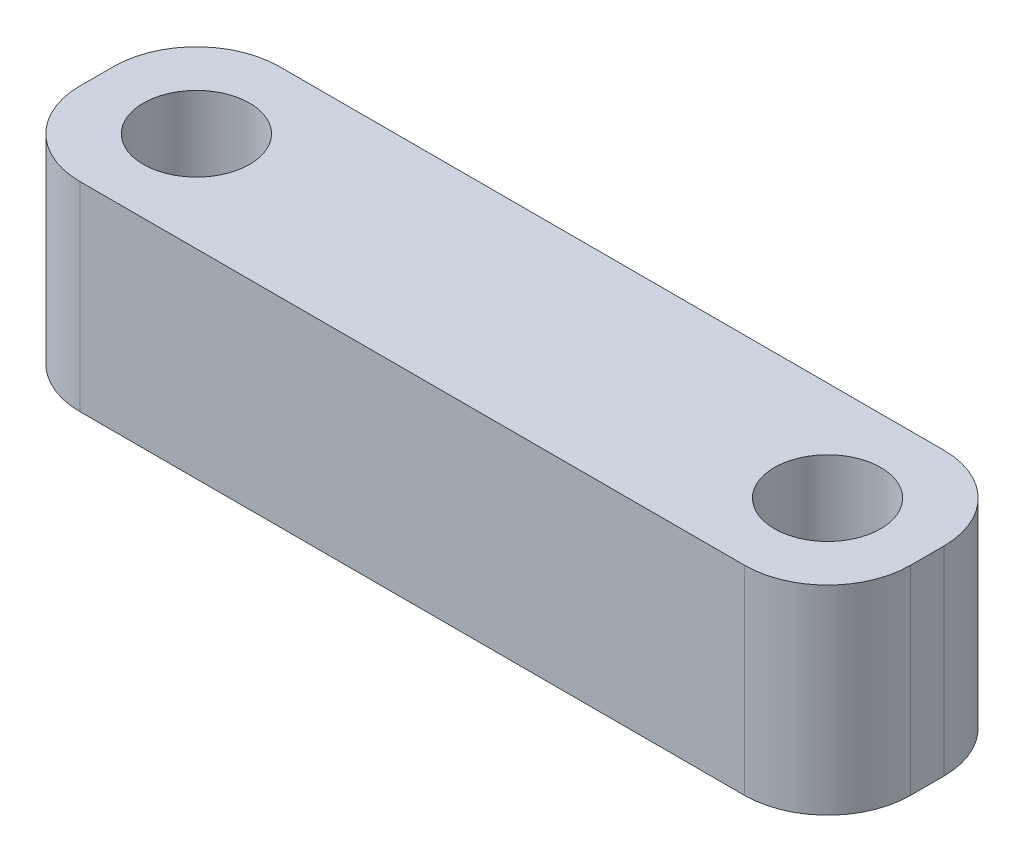
ISO-10303-21;
HEADER;
FILE_DESCRIPTION(('STEP AP214'),'2;1');
FILE_NAME('part.step','',(''),(''),'','','');
FILE_SCHEMA(('AUTOMOTIVE_DESIGN { 1 0 10303 214 1 1 1 1 }'));
ENDSEC;
DATA;
#1=APPLICATION_CONTEXT('core data for automotive mechanical design processes');
#2=APPLICATION_PROTOCOL_DEFINITION('international standard','automotive_design',2000,#1);
#3=PRODUCT_CONTEXT('',#1,'mechanical');
#4=PRODUCT('Part','Part','',(#3));
#5=PRODUCT_RELATED_PRODUCT_CATEGORY('part','',(#4));
#6=PRODUCT_DEFINITION_FORMATION('','',#4);
#7=PRODUCT_DEFINITION_CONTEXT('part definition',#1,'design');
#8=PRODUCT_DEFINITION('design','',#6,#7);
#9=PRODUCT_DEFINITION_SHAPE('','',#8);
#10=(LENGTH_UNIT() NAMED_UNIT(*) SI_UNIT(.MILLI.,.METRE.));
#11=(NAMED_UNIT(*) PLANE_ANGLE_UNIT() SI_UNIT($,.RADIAN.));
#12=(NAMED_UNIT(*) SI_UNIT($,.STERADIAN.) SOLID_ANGLE_UNIT());
#13=UNCERTAINTY_MEASURE_WITH_UNIT(LENGTH_MEASURE(1.E-05),#10,'distance_accuracy_value','');
#14=(GEOMETRIC_REPRESENTATION_CONTEXT(3) GLOBAL_UNCERTAINTY_ASSIGNED_CONTEXT((#13)) GLOBAL_UNIT_ASSIGNED_CONTEXT((#10,
#11,#12)) REPRESENTATION_CONTEXT('',''));
#15=CARTESIAN_POINT('',(0.,0.,0.));
#16=DIRECTION('',(0.,0.,1.));
#17=DIRECTION('',(1.,0.,0.));
#18=AXIS2_PLACEMENT_3D('',#15,#16,#17);
#19=CARTESIAN_POINT('',(12.5,3.,3.));
#20=DIRECTION('',(-1.,0.,0.));
#21=DIRECTION('',(0.,0.,1.));
#22=AXIS2_PLACEMENT_3D('',#19,#20,#21);
#23=PLANE('',#22);
#24=DIRECTION('',(0.,0.,-1.));
#25=VECTOR('',#24,1.);
#26=CARTESIAN_POINT('',(12.5,-3.,3.));
#27=LINE('',#26,#25);
#28=CARTESIAN_POINT('',(12.5,-3.,0.5));
#29=VERTEX_POINT('',#28);
#30=CARTESIAN_POINT('',(12.5,-3.,-0.5));
#31=VERTEX_POINT('',#30);
#32=EDGE_CURVE('E182',#29,#31,#27,.T.);
#33=ORIENTED_EDGE('',*,*,#32,.T.);
#34=DIRECTION('',(0.,-1.,0.));
#35=VECTOR('',#34,1.);
#36=CARTESIAN_POINT('',(12.5,3.,-0.5));
#37=LINE('',#36,#35);
#38=CARTESIAN_POINT('',(12.5,3.,-0.5));
#39=VERTEX_POINT('',#38);
#40=EDGE_CURVE('E11',#31,#39,#37,.F.);
#41=ORIENTED_EDGE('',*,*,#40,.T.);
#42=DIRECTION('',(0.,0.,-1.));
#43=VECTOR('',#42,1.);
#44=CARTESIAN_POINT('',(12.5,3.,3.));
#45=LINE('',#44,#43);
#46=CARTESIAN_POINT('',(12.5,3.,0.5));
#47=VERTEX_POINT('',#46);
#48=EDGE_CURVE('E135',#47,#39,#45,.T.);
#49=ORIENTED_EDGE('',*,*,#48,.F.);
#50=DIRECTION('',(0.,-1.,0.));
#51=VECTOR('',#50,1.);
#52=CARTESIAN_POINT('',(12.5,3.,0.5));
#53=LINE('',#52,#51);
#54=EDGE_CURVE('E48',#47,#29,#53,.T.);
#55=ORIENTED_EDGE('',*,*,#54,.T.);
#56=EDGE_LOOP('',(#33,#41,#49,#55));
#57=FACE_BOUND('',#56,.T.);
#58=ADVANCED_FACE('F39',(#57),#23,.F.);
#59=CARTESIAN_POINT('',(-12.5,3.,-3.));
#60=DIRECTION('',(0.,0.,1.));
#61=DIRECTION('',(1.,0.,0.));
#62=AXIS2_PLACEMENT_3D('',#59,#60,#61);
#63=PLANE('',#62);
#64=DIRECTION('',(-1.,0.,0.));
#65=VECTOR('',#64,1.);
#66=CARTESIAN_POINT('',(-12.5,-3.,-3.));
#67=LINE('',#66,#65);
#68=CARTESIAN_POINT('',(10.,-3.,-3.));
#69=VERTEX_POINT('',#68);
#70=CARTESIAN_POINT('',(-10.,-3.,-3.));
#71=VERTEX_POINT('',#70);
#72=EDGE_CURVE('E142',#69,#71,#67,.T.);
#73=ORIENTED_EDGE('',*,*,#72,.T.);
#74=DIRECTION('',(0.,-1.,0.));
#75=VECTOR('',#74,1.);
#76=CARTESIAN_POINT('',(-10.,3.,-3.));
#77=LINE('',#76,#75);
#78=CARTESIAN_POINT('',(-10.,3.,-3.));
#79=VERTEX_POINT('',#78);
#80=EDGE_CURVE('E55',#71,#79,#77,.F.);
#81=ORIENTED_EDGE('',*,*,#80,.T.);
#82=DIRECTION('',(-1.,0.,0.));
#83=VECTOR('',#82,1.);
#84=CARTESIAN_POINT('',(-12.5,3.,-3.));
#85=LINE('',#84,#83);
#86=CARTESIAN_POINT('',(10.,3.,-3.));
#87=VERTEX_POINT('',#86);
#88=EDGE_CURVE('E140',#87,#79,#85,.T.);
#89=ORIENTED_EDGE('',*,*,#88,.F.);
#90=DIRECTION('',(0.,-1.,0.));
#91=VECTOR('',#90,1.);
#92=CARTESIAN_POINT('',(10.,3.,-3.));
#93=LINE('',#92,#91);
#94=EDGE_CURVE('E171',#87,#69,#93,.T.);
#95=ORIENTED_EDGE('',*,*,#94,.T.);
#96=EDGE_LOOP('',(#73,#81,#89,#95));
#97=FACE_BOUND('',#96,.T.);
#98=ADVANCED_FACE('F230',(#97),#63,.F.);
#99=CARTESIAN_POINT('',(-12.5,3.,3.));
#100=DIRECTION('',(1.,0.,0.));
#101=DIRECTION('',(0.,0.,-1.));
#102=AXIS2_PLACEMENT_3D('',#99,#100,#101);
#103=PLANE('',#102);
#104=DIRECTION('',(0.,0.,1.));
#105=VECTOR('',#104,1.);
#106=CARTESIAN_POINT('',(-12.5,-3.,3.));
#107=LINE('',#106,#105);
#108=CARTESIAN_POINT('',(-12.5,-3.,-0.5));
#109=VERTEX_POINT('',#108);
#110=CARTESIAN_POINT('',(-12.5,-3.,0.5));
#111=VERTEX_POINT('',#110);
#112=EDGE_CURVE('E136',#109,#111,#107,.T.);
#113=ORIENTED_EDGE('',*,*,#112,.T.);
#114=DIRECTION('',(0.,-1.,0.));
#115=VECTOR('',#114,1.);
#116=CARTESIAN_POINT('',(-12.5,3.,0.5));
#117=LINE('',#116,#115);
#118=CARTESIAN_POINT('',(-12.5,3.,0.5));
#119=VERTEX_POINT('',#118);
#120=EDGE_CURVE('E111',#111,#119,#117,.F.);
#121=ORIENTED_EDGE('',*,*,#120,.T.);
#122=DIRECTION('',(0.,0.,1.));
#123=VECTOR('',#122,1.);
#124=CARTESIAN_POINT('',(-12.5,3.,3.));
#125=LINE('',#124,#123);
#126=CARTESIAN_POINT('',(-12.5,3.,-0.5));
#127=VERTEX_POINT('',#126);
#128=EDGE_CURVE('E198',#127,#119,#125,.T.);
#129=ORIENTED_EDGE('',*,*,#128,.F.);
#130=DIRECTION('',(0.,-1.,0.));
#131=VECTOR('',#130,1.);
#132=CARTESIAN_POINT('',(-12.5,3.,-0.5));
#133=LINE('',#132,#131);
#134=EDGE_CURVE('E117',#127,#109,#133,.T.);
#135=ORIENTED_EDGE('',*,*,#134,.T.);
#136=EDGE_LOOP('',(#113,#121,#129,#135));
#137=FACE_BOUND('',#136,.T.);
#138=ADVANCED_FACE('F227',(#137),#103,.F.);
#139=CARTESIAN_POINT('',(-12.5,3.,3.));
#140=DIRECTION('',(0.,0.,-1.));
#141=DIRECTION('',(-1.,0.,0.));
#142=AXIS2_PLACEMENT_3D('',#139,#140,#141);
#143=PLANE('',#142);
#144=DIRECTION('',(1.,0.,0.));
#145=VECTOR('',#144,1.);
#146=CARTESIAN_POINT('',(-12.5,3.,3.));
#147=LINE('',#146,#145);
#148=CARTESIAN_POINT('',(-10.,3.,3.));
#149=VERTEX_POINT('',#148);
#150=CARTESIAN_POINT('',(10.,3.,3.));
#151=VERTEX_POINT('',#150);
#152=EDGE_CURVE('E127',#149,#151,#147,.T.);
#153=ORIENTED_EDGE('',*,*,#152,.F.);
#154=DIRECTION('',(0.,-1.,0.));
#155=VECTOR('',#154,1.);
#156=CARTESIAN_POINT('',(-10.,3.,3.));
#157=LINE('',#156,#155);
#158=CARTESIAN_POINT('',(-10.,-3.,3.));
#159=VERTEX_POINT('',#158);
#160=EDGE_CURVE('E110',#149,#159,#157,.T.);
#161=ORIENTED_EDGE('',*,*,#160,.T.);
#162=DIRECTION('',(1.,0.,0.));
#163=VECTOR('',#162,1.);
#164=CARTESIAN_POINT('',(-12.5,-3.,3.));
#165=LINE('',#164,#163);
#166=CARTESIAN_POINT('',(10.,-3.,3.));
#167=VERTEX_POINT('',#166);
#168=EDGE_CURVE('E124',#159,#167,#165,.T.);
#169=ORIENTED_EDGE('',*,*,#168,.T.);
#170=DIRECTION('',(0.,-1.,0.));
#171=VECTOR('',#170,1.);
#172=CARTESIAN_POINT('',(10.,3.,3.));
#173=LINE('',#172,#171);
#174=EDGE_CURVE('E130',#167,#151,#173,.F.);
#175=ORIENTED_EDGE('',*,*,#174,.T.);
#176=EDGE_LOOP('',(#153,#161,#169,#175));
#177=FACE_BOUND('',#176,.T.);
#178=ADVANCED_FACE('F123',(#177),#143,.F.);
#179=CARTESIAN_POINT('',(0.,3.,0.));
#180=DIRECTION('',(0.,-1.,0.));
#181=DIRECTION('',(0.,0.,-1.));
#182=AXIS2_PLACEMENT_3D('',#179,#180,#181);
#183=PLANE('',#182);
#184=CARTESIAN_POINT('',(9.50000000000001,3.,0.));
#185=DIRECTION('',(0.,1.,0.));
#186=DIRECTION('',(0.,0.,1.));
#187=AXIS2_PLACEMENT_3D('',#184,#185,#186);
#188=CIRCLE('',#187,1.6);
#189=CARTESIAN_POINT('',(9.50000000000001,3.,1.6));
#190=VERTEX_POINT('',#189);
#191=EDGE_CURVE('E193',#190,#190,#188,.T.);
#192=ORIENTED_EDGE('',*,*,#191,.F.);
#193=EDGE_LOOP('',(#192));
#194=FACE_BOUND('',#193,.T.);
#195=CARTESIAN_POINT('',(-9.5,3.,0.));
#196=DIRECTION('',(0.,1.,0.));
#197=DIRECTION('',(0.,0.,1.));
#198=AXIS2_PLACEMENT_3D('',#195,#196,#197);
#199=CIRCLE('',#198,1.6);
#200=CARTESIAN_POINT('',(-9.5,3.,1.6));
#201=VERTEX_POINT('',#200);
#202=EDGE_CURVE('E204',#201,#201,#199,.T.);
#203=ORIENTED_EDGE('',*,*,#202,.F.);
#204=EDGE_LOOP('',(#203));
#205=FACE_BOUND('',#204,.T.);
#206=ORIENTED_EDGE('',*,*,#128,.T.);
#207=CARTESIAN_POINT('',(-10.,3.,0.5));
#208=DIRECTION('',(0.,-1.,0.));
#209=DIRECTION('',(0.,0.,-1.));
#210=AXIS2_PLACEMENT_3D('',#207,#208,#209);
#211=CIRCLE('',#210,2.5);
#212=EDGE_CURVE('E168',#119,#149,#211,.F.);
#213=ORIENTED_EDGE('',*,*,#212,.T.);
#214=ORIENTED_EDGE('',*,*,#152,.T.);
#215=CARTESIAN_POINT('',(10.,3.,0.5));
#216=DIRECTION('',(0.,-1.,0.));
#217=DIRECTION('',(0.,0.,-1.));
#218=AXIS2_PLACEMENT_3D('',#215,#216,#217);
#219=CIRCLE('',#218,2.5);
#220=EDGE_CURVE('E160',#151,#47,#219,.F.);
#221=ORIENTED_EDGE('',*,*,#220,.T.);
#222=ORIENTED_EDGE('',*,*,#48,.T.);
#223=CARTESIAN_POINT('',(10.,3.,-0.5));
#224=DIRECTION('',(0.,-1.,0.));
#225=DIRECTION('',(0.,0.,-1.));
#226=AXIS2_PLACEMENT_3D('',#223,#224,#225);
#227=CIRCLE('',#226,2.5);
#228=EDGE_CURVE('E62',#39,#87,#227,.F.);
#229=ORIENTED_EDGE('',*,*,#228,.T.);
#230=ORIENTED_EDGE('',*,*,#88,.T.);
#231=CARTESIAN_POINT('',(-10.,3.,-0.5));
#232=DIRECTION('',(0.,-1.,0.));
#233=DIRECTION('',(0.,0.,-1.));
#234=AXIS2_PLACEMENT_3D('',#231,#232,#233);
#235=CIRCLE('',#234,2.5);
#236=EDGE_CURVE('E165',#79,#127,#235,.F.);
#237=ORIENTED_EDGE('',*,*,#236,.T.);
#238=EDGE_LOOP('',(#206,#213,#214,#221,#222,#229,#230,#237));
#239=FACE_BOUND('',#238,.T.);
#240=ADVANCED_FACE('F218',(#194,#205,#239),#183,.F.);
#241=CARTESIAN_POINT('',(0.,-3.,0.));
#242=DIRECTION('',(0.,-1.,0.));
#243=DIRECTION('',(0.,0.,-1.));
#244=AXIS2_PLACEMENT_3D('',#241,#242,#243);
#245=PLANE('',#244);
#246=CARTESIAN_POINT('',(9.50000000000001,-3.,0.));
#247=DIRECTION('',(0.,1.,0.));
#248=DIRECTION('',(0.,0.,1.));
#249=AXIS2_PLACEMENT_3D('',#246,#247,#248);
#250=CIRCLE('',#249,1.6);
#251=CARTESIAN_POINT('',(9.50000000000001,-3.,1.6));
#252=VERTEX_POINT('',#251);
#253=EDGE_CURVE('E188',#252,#252,#250,.T.);
#254=ORIENTED_EDGE('',*,*,#253,.T.);
#255=EDGE_LOOP('',(#254));
#256=FACE_BOUND('',#255,.T.);
#257=CARTESIAN_POINT('',(-9.5,-3.,0.));
#258=DIRECTION('',(0.,1.,0.));
#259=DIRECTION('',(0.,0.,1.));
#260=AXIS2_PLACEMENT_3D('',#257,#258,#259);
#261=CIRCLE('',#260,1.6);
#262=CARTESIAN_POINT('',(-9.5,-3.,1.6));
#263=VERTEX_POINT('',#262);
#264=EDGE_CURVE('E208',#263,#263,#261,.T.);
#265=ORIENTED_EDGE('',*,*,#264,.T.);
#266=EDGE_LOOP('',(#265));
#267=FACE_BOUND('',#266,.T.);
#268=ORIENTED_EDGE('',*,*,#168,.F.);
#269=CARTESIAN_POINT('',(-10.,-3.,0.5));
#270=DIRECTION('',(0.,-1.,0.));
#271=DIRECTION('',(0.,0.,-1.));
#272=AXIS2_PLACEMENT_3D('',#269,#270,#271);
#273=CIRCLE('',#272,2.5);
#274=EDGE_CURVE('E106',#159,#111,#273,.T.);
#275=ORIENTED_EDGE('',*,*,#274,.T.);
#276=ORIENTED_EDGE('',*,*,#112,.F.);
#277=CARTESIAN_POINT('',(-10.,-3.,-0.5));
#278=DIRECTION('',(0.,-1.,0.));
#279=DIRECTION('',(0.,0.,-1.));
#280=AXIS2_PLACEMENT_3D('',#277,#278,#279);
#281=CIRCLE('',#280,2.5);
#282=EDGE_CURVE('E118',#109,#71,#281,.T.);
#283=ORIENTED_EDGE('',*,*,#282,.T.);
#284=ORIENTED_EDGE('',*,*,#72,.F.);
#285=CARTESIAN_POINT('',(10.,-3.,-0.5));
#286=DIRECTION('',(0.,-1.,0.));
#287=DIRECTION('',(0.,0.,-1.));
#288=AXIS2_PLACEMENT_3D('',#285,#286,#287);
#289=CIRCLE('',#288,2.5);
#290=EDGE_CURVE('E150',#69,#31,#289,.T.);
#291=ORIENTED_EDGE('',*,*,#290,.T.);
#292=ORIENTED_EDGE('',*,*,#32,.F.);
#293=CARTESIAN_POINT('',(10.,-3.,0.5));
#294=DIRECTION('',(0.,-1.,0.));
#295=DIRECTION('',(0.,0.,-1.));
#296=AXIS2_PLACEMENT_3D('',#293,#294,#295);
#297=CIRCLE('',#296,2.5);
#298=EDGE_CURVE('E129',#29,#167,#297,.T.);
#299=ORIENTED_EDGE('',*,*,#298,.T.);
#300=EDGE_LOOP('',(#268,#275,#276,#283,#284,#291,#292,#299));
#301=FACE_BOUND('',#300,.T.);
#302=ADVANCED_FACE('F132',(#256,#267,#301),#245,.T.);
#303=CARTESIAN_POINT('',(-9.5,-3.,0.));
#304=DIRECTION('',(0.,1.,0.));
#305=DIRECTION('',(0.,0.,1.));
#306=AXIS2_PLACEMENT_3D('',#303,#304,#305);
#307=CYLINDRICAL_SURFACE('',#306,1.6);
#308=ORIENTED_EDGE('',*,*,#264,.F.);
#309=EDGE_LOOP('',(#308));
#310=FACE_BOUND('',#309,.T.);
#311=ORIENTED_EDGE('',*,*,#202,.T.);
#312=EDGE_LOOP('',(#311));
#313=FACE_BOUND('',#312,.T.);
#314=ADVANCED_FACE('F278',(#310,#313),#307,.F.);
#315=CARTESIAN_POINT('',(9.50000000000001,-3.,0.));
#316=DIRECTION('',(0.,1.,0.));
#317=DIRECTION('',(0.,0.,1.));
#318=AXIS2_PLACEMENT_3D('',#315,#316,#317);
#319=CYLINDRICAL_SURFACE('',#318,1.6);
#320=ORIENTED_EDGE('',*,*,#253,.F.);
#321=EDGE_LOOP('',(#320));
#322=FACE_BOUND('',#321,.T.);
#323=ORIENTED_EDGE('',*,*,#191,.T.);
#324=EDGE_LOOP('',(#323));
#325=FACE_BOUND('',#324,.T.);
#326=ADVANCED_FACE('F216',(#322,#325),#319,.F.);
#327=CARTESIAN_POINT('',(-10.,3.,0.5));
#328=DIRECTION('',(0.,-1.,0.));
#329=DIRECTION('',(0.,0.,-1.));
#330=AXIS2_PLACEMENT_3D('',#327,#328,#329);
#331=CYLINDRICAL_SURFACE('',#330,2.5);
#332=ORIENTED_EDGE('',*,*,#212,.F.);
#333=ORIENTED_EDGE('',*,*,#120,.F.);
#334=ORIENTED_EDGE('',*,*,#274,.F.);
#335=ORIENTED_EDGE('',*,*,#160,.F.);
#336=EDGE_LOOP('',(#332,#333,#334,#335));
#337=FACE_BOUND('',#336,.T.);
#338=ADVANCED_FACE('F109',(#337),#331,.T.);
#339=CARTESIAN_POINT('',(-10.,3.,-0.5));
#340=DIRECTION('',(0.,-1.,0.));
#341=DIRECTION('',(0.,0.,-1.));
#342=AXIS2_PLACEMENT_3D('',#339,#340,#341);
#343=CYLINDRICAL_SURFACE('',#342,2.5);
#344=ORIENTED_EDGE('',*,*,#236,.F.);
#345=ORIENTED_EDGE('',*,*,#80,.F.);
#346=ORIENTED_EDGE('',*,*,#282,.F.);
#347=ORIENTED_EDGE('',*,*,#134,.F.);
#348=EDGE_LOOP('',(#344,#345,#346,#347));
#349=FACE_BOUND('',#348,.T.);
#350=ADVANCED_FACE('F229',(#349),#343,.T.);
#351=CARTESIAN_POINT('',(10.,3.,-0.5));
#352=DIRECTION('',(0.,-1.,0.));
#353=DIRECTION('',(0.,0.,-1.));
#354=AXIS2_PLACEMENT_3D('',#351,#352,#353);
#355=CYLINDRICAL_SURFACE('',#354,2.5);
#356=ORIENTED_EDGE('',*,*,#228,.F.);
#357=ORIENTED_EDGE('',*,*,#40,.F.);
#358=ORIENTED_EDGE('',*,*,#290,.F.);
#359=ORIENTED_EDGE('',*,*,#94,.F.);
#360=EDGE_LOOP('',(#356,#357,#358,#359));
#361=FACE_BOUND('',#360,.T.);
#362=ADVANCED_FACE('F233',(#361),#355,.T.);
#363=CARTESIAN_POINT('',(10.,3.,0.5));
#364=DIRECTION('',(0.,-1.,0.));
#365=DIRECTION('',(0.,0.,-1.));
#366=AXIS2_PLACEMENT_3D('',#363,#364,#365);
#367=CYLINDRICAL_SURFACE('',#366,2.5);
#368=ORIENTED_EDGE('',*,*,#220,.F.);
#369=ORIENTED_EDGE('',*,*,#174,.F.);
#370=ORIENTED_EDGE('',*,*,#298,.F.);
#371=ORIENTED_EDGE('',*,*,#54,.F.);
#372=EDGE_LOOP('',(#368,#369,#370,#371));
#373=FACE_BOUND('',#372,.T.);
#374=ADVANCED_FACE('F41',(#373),#367,.T.);
#375=CLOSED_SHELL('',(#58,#98,#138,#178,#240,#302,#314,#326,#338,#350,#362,#374));
#376=MANIFOLD_SOLID_BREP('B2',#375);
#377=ADVANCED_BREP_SHAPE_REPRESENTATION('',(#18,#376),#14);
#378=SHAPE_DEFINITION_REPRESENTATION(#9,#377);
ENDSEC;
END-ISO-10303-21;
